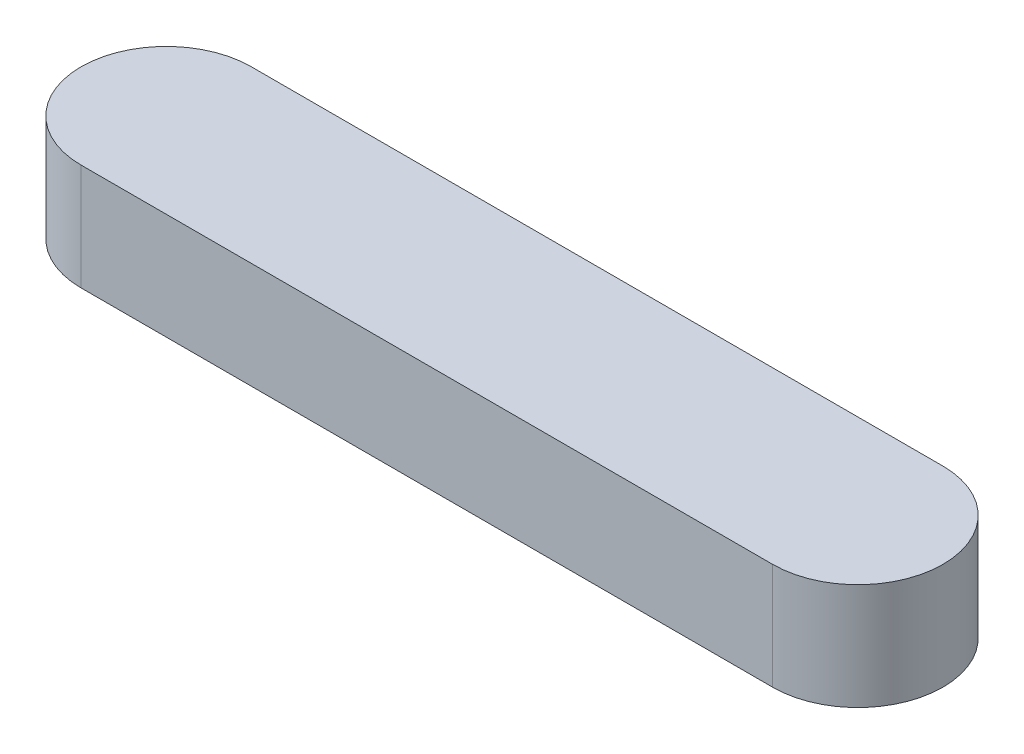
ISO-10303-21;
HEADER;
FILE_DESCRIPTION(('STEP AP214'),'2;1');
FILE_NAME('part.step','',(''),(''),'','','');
FILE_SCHEMA(('AUTOMOTIVE_DESIGN { 1 0 10303 214 1 1 1 1 }'));
ENDSEC;
DATA;
#1=APPLICATION_CONTEXT('core data for automotive mechanical design processes');
#2=APPLICATION_PROTOCOL_DEFINITION('international standard','automotive_design',2000,#1);
#3=PRODUCT_CONTEXT('',#1,'mechanical');
#4=PRODUCT('Part','Part','',(#3));
#5=PRODUCT_RELATED_PRODUCT_CATEGORY('part','',(#4));
#6=PRODUCT_DEFINITION_FORMATION('','',#4);
#7=PRODUCT_DEFINITION_CONTEXT('part definition',#1,'design');
#8=PRODUCT_DEFINITION('design','',#6,#7);
#9=PRODUCT_DEFINITION_SHAPE('','',#8);
#10=(LENGTH_UNIT() NAMED_UNIT(*) SI_UNIT(.MILLI.,.METRE.));
#11=(NAMED_UNIT(*) PLANE_ANGLE_UNIT() SI_UNIT($,.RADIAN.));
#12=(NAMED_UNIT(*) SI_UNIT($,.STERADIAN.) SOLID_ANGLE_UNIT());
#13=UNCERTAINTY_MEASURE_WITH_UNIT(LENGTH_MEASURE(1.E-05),#10,'distance_accuracy_value','');
#14=(GEOMETRIC_REPRESENTATION_CONTEXT(3) GLOBAL_UNCERTAINTY_ASSIGNED_CONTEXT((#13)) GLOBAL_UNIT_ASSIGNED_CONTEXT((#10,
#11,#12)) REPRESENTATION_CONTEXT('',''));
#15=CARTESIAN_POINT('',(0.,0.,0.));
#16=DIRECTION('',(0.,0.,1.));
#17=DIRECTION('',(1.,0.,0.));
#18=AXIS2_PLACEMENT_3D('',#15,#16,#17);
#19=CARTESIAN_POINT('',(-32.5,10.,0.));
#20=DIRECTION('',(0.,-1.,0.));
#21=DIRECTION('',(0.,0.,-1.));
#22=AXIS2_PLACEMENT_3D('',#19,#20,#21);
#23=CYLINDRICAL_SURFACE('',#22,8.);
#24=CARTESIAN_POINT('',(-32.5,0.,0.));
#25=DIRECTION('',(0.,1.,0.));
#26=DIRECTION('',(0.,0.,1.));
#27=AXIS2_PLACEMENT_3D('',#24,#25,#26);
#28=CIRCLE('',#27,8.);
#29=CARTESIAN_POINT('',(-32.5,0.,-8.));
#30=VERTEX_POINT('',#29);
#31=CARTESIAN_POINT('',(-32.5,0.,8.));
#32=VERTEX_POINT('',#31);
#33=EDGE_CURVE('E107',#30,#32,#28,.T.);
#34=ORIENTED_EDGE('',*,*,#33,.T.);
#35=DIRECTION('',(0.,-1.,0.));
#36=VECTOR('',#35,1.);
#37=CARTESIAN_POINT('',(-32.5,10.,8.));
#38=LINE('',#37,#36);
#39=CARTESIAN_POINT('',(-32.5,10.,8.));
#40=VERTEX_POINT('',#39);
#41=EDGE_CURVE('E11',#40,#32,#38,.T.);
#42=ORIENTED_EDGE('',*,*,#41,.F.);
#43=CARTESIAN_POINT('',(-32.5,10.,0.));
#44=DIRECTION('',(0.,1.,0.));
#45=DIRECTION('',(0.,0.,1.));
#46=AXIS2_PLACEMENT_3D('',#43,#44,#45);
#47=CIRCLE('',#46,8.);
#48=CARTESIAN_POINT('',(-32.5,10.,-8.));
#49=VERTEX_POINT('',#48);
#50=EDGE_CURVE('E91',#49,#40,#47,.T.);
#51=ORIENTED_EDGE('',*,*,#50,.F.);
#52=DIRECTION('',(0.,-1.,0.));
#53=VECTOR('',#52,1.);
#54=CARTESIAN_POINT('',(-32.5,10.,-8.));
#55=LINE('',#54,#53);
#56=EDGE_CURVE('E103',#49,#30,#55,.T.);
#57=ORIENTED_EDGE('',*,*,#56,.T.);
#58=EDGE_LOOP('',(#34,#42,#51,#57));
#59=FACE_BOUND('',#58,.T.);
#60=ADVANCED_FACE('F39',(#59),#23,.T.);
#61=CARTESIAN_POINT('',(-32.5,10.,8.));
#62=DIRECTION('',(0.,0.,-1.));
#63=DIRECTION('',(-1.,0.,0.));
#64=AXIS2_PLACEMENT_3D('',#61,#62,#63);
#65=PLANE('',#64);
#66=DIRECTION('',(1.,0.,0.));
#67=VECTOR('',#66,1.);
#68=CARTESIAN_POINT('',(-32.5,0.,8.));
#69=LINE('',#68,#67);
#70=CARTESIAN_POINT('',(32.5,0.,7.99999999999999));
#71=VERTEX_POINT('',#70);
#72=EDGE_CURVE('E96',#32,#71,#69,.T.);
#73=ORIENTED_EDGE('',*,*,#72,.T.);
#74=DIRECTION('',(0.,-1.,0.));
#75=VECTOR('',#74,1.);
#76=CARTESIAN_POINT('',(32.5,10.,7.99999999999999));
#77=LINE('',#76,#75);
#78=CARTESIAN_POINT('',(32.5,10.,7.99999999999999));
#79=VERTEX_POINT('',#78);
#80=EDGE_CURVE('E48',#79,#71,#77,.T.);
#81=ORIENTED_EDGE('',*,*,#80,.F.);
#82=DIRECTION('',(1.,0.,0.));
#83=VECTOR('',#82,1.);
#84=CARTESIAN_POINT('',(-32.5,10.,8.));
#85=LINE('',#84,#83);
#86=EDGE_CURVE('E86',#40,#79,#85,.T.);
#87=ORIENTED_EDGE('',*,*,#86,.F.);
#88=ORIENTED_EDGE('',*,*,#41,.T.);
#89=EDGE_LOOP('',(#73,#81,#87,#88));
#90=FACE_BOUND('',#89,.T.);
#91=ADVANCED_FACE('F95',(#90),#65,.F.);
#92=CARTESIAN_POINT('',(32.5,10.,0.));
#93=DIRECTION('',(0.,-1.,0.));
#94=DIRECTION('',(0.,0.,-1.));
#95=AXIS2_PLACEMENT_3D('',#92,#93,#94);
#96=CYLINDRICAL_SURFACE('',#95,8.);
#97=CARTESIAN_POINT('',(32.5,0.,0.));
#98=DIRECTION('',(0.,1.,0.));
#99=DIRECTION('',(0.,0.,1.));
#100=AXIS2_PLACEMENT_3D('',#97,#98,#99);
#101=CIRCLE('',#100,8.);
#102=CARTESIAN_POINT('',(32.5,0.,-8.00000000000001));
#103=VERTEX_POINT('',#102);
#104=EDGE_CURVE('E73',#71,#103,#101,.T.);
#105=ORIENTED_EDGE('',*,*,#104,.T.);
#106=DIRECTION('',(0.,-1.,0.));
#107=VECTOR('',#106,1.);
#108=CARTESIAN_POINT('',(32.5,10.,-8.00000000000001));
#109=LINE('',#108,#107);
#110=CARTESIAN_POINT('',(32.5,10.,-8.00000000000001));
#111=VERTEX_POINT('',#110);
#112=EDGE_CURVE('E98',#111,#103,#109,.T.);
#113=ORIENTED_EDGE('',*,*,#112,.F.);
#114=CARTESIAN_POINT('',(32.5,10.,0.));
#115=DIRECTION('',(0.,1.,0.));
#116=DIRECTION('',(0.,0.,1.));
#117=AXIS2_PLACEMENT_3D('',#114,#115,#116);
#118=CIRCLE('',#117,8.);
#119=EDGE_CURVE('E89',#79,#111,#118,.T.);
#120=ORIENTED_EDGE('',*,*,#119,.F.);
#121=ORIENTED_EDGE('',*,*,#80,.T.);
#122=EDGE_LOOP('',(#105,#113,#120,#121));
#123=FACE_BOUND('',#122,.T.);
#124=ADVANCED_FACE('F99',(#123),#96,.T.);
#125=CARTESIAN_POINT('',(-32.5,10.,-8.));
#126=DIRECTION('',(0.,0.,1.));
#127=DIRECTION('',(1.,0.,0.));
#128=AXIS2_PLACEMENT_3D('',#125,#126,#127);
#129=PLANE('',#128);
#130=DIRECTION('',(-1.,0.,0.));
#131=VECTOR('',#130,1.);
#132=CARTESIAN_POINT('',(-32.5,0.,-8.));
#133=LINE('',#132,#131);
#134=EDGE_CURVE('E79',#103,#30,#133,.T.);
#135=ORIENTED_EDGE('',*,*,#134,.T.);
#136=ORIENTED_EDGE('',*,*,#56,.F.);
#137=DIRECTION('',(-1.,0.,0.));
#138=VECTOR('',#137,1.);
#139=CARTESIAN_POINT('',(-32.5,10.,-8.));
#140=LINE('',#139,#138);
#141=EDGE_CURVE('E56',#111,#49,#140,.T.);
#142=ORIENTED_EDGE('',*,*,#141,.F.);
#143=ORIENTED_EDGE('',*,*,#112,.T.);
#144=EDGE_LOOP('',(#135,#136,#142,#143));
#145=FACE_BOUND('',#144,.T.);
#146=ADVANCED_FACE('F120',(#145),#129,.F.);
#147=CARTESIAN_POINT('',(-32.5,10.,0.));
#148=DIRECTION('',(0.,1.,0.));
#149=DIRECTION('',(0.,0.,1.));
#150=AXIS2_PLACEMENT_3D('',#147,#148,#149);
#151=PLANE('',#150);
#152=ORIENTED_EDGE('',*,*,#50,.T.);
#153=ORIENTED_EDGE('',*,*,#86,.T.);
#154=ORIENTED_EDGE('',*,*,#119,.T.);
#155=ORIENTED_EDGE('',*,*,#141,.T.);
#156=EDGE_LOOP('',(#152,#153,#154,#155));
#157=FACE_BOUND('',#156,.T.);
#158=ADVANCED_FACE('F87',(#157),#151,.T.);
#159=CARTESIAN_POINT('',(-32.5,0.,0.));
#160=DIRECTION('',(0.,1.,0.));
#161=DIRECTION('',(0.,0.,1.));
#162=AXIS2_PLACEMENT_3D('',#159,#160,#161);
#163=PLANE('',#162);
#164=ORIENTED_EDGE('',*,*,#33,.F.);
#165=ORIENTED_EDGE('',*,*,#134,.F.);
#166=ORIENTED_EDGE('',*,*,#104,.F.);
#167=ORIENTED_EDGE('',*,*,#72,.F.);
#168=EDGE_LOOP('',(#164,#165,#166,#167));
#169=FACE_BOUND('',#168,.T.);
#170=ADVANCED_FACE('F123',(#169),#163,.F.);
#171=CLOSED_SHELL('',(#60,#91,#124,#146,#158,#170));
#172=MANIFOLD_SOLID_BREP('B2',#171);
#173=ADVANCED_BREP_SHAPE_REPRESENTATION('',(#18,#172),#14);
#174=SHAPE_DEFINITION_REPRESENTATION(#9,#173);
ENDSEC;
END-ISO-10303-21;
